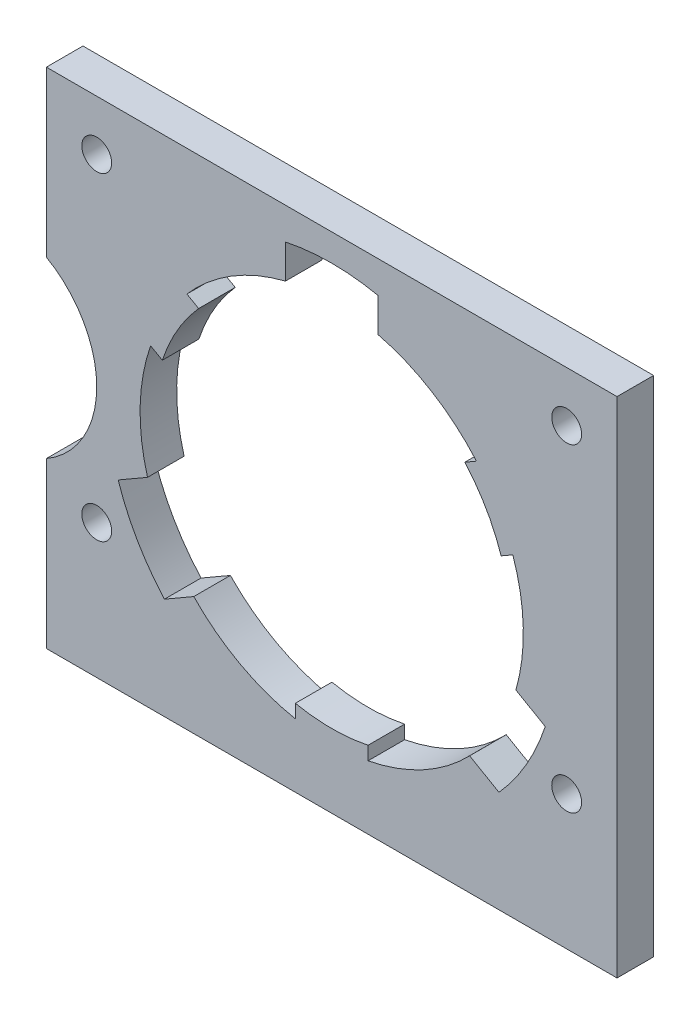
ISO-10303-21;
HEADER;
FILE_DESCRIPTION(('STEP AP214'),'2;1');
FILE_NAME('part.step','',(''),(''),'','','');
FILE_SCHEMA(('AUTOMOTIVE_DESIGN { 1 0 10303 214 1 1 1 1 }'));
ENDSEC;
DATA;
#1=APPLICATION_CONTEXT('core data for automotive mechanical design processes');
#2=APPLICATION_PROTOCOL_DEFINITION('international standard','automotive_design',2000,#1);
#3=PRODUCT_CONTEXT('',#1,'mechanical');
#4=PRODUCT('Part','Part','',(#3));
#5=PRODUCT_RELATED_PRODUCT_CATEGORY('part','',(#4));
#6=PRODUCT_DEFINITION_FORMATION('','',#4);
#7=PRODUCT_DEFINITION_CONTEXT('part definition',#1,'design');
#8=PRODUCT_DEFINITION('design','',#6,#7);
#9=PRODUCT_DEFINITION_SHAPE('','',#8);
#10=(LENGTH_UNIT() NAMED_UNIT(*) SI_UNIT(.MILLI.,.METRE.));
#11=(NAMED_UNIT(*) PLANE_ANGLE_UNIT() SI_UNIT($,.RADIAN.));
#12=(NAMED_UNIT(*) SI_UNIT($,.STERADIAN.) SOLID_ANGLE_UNIT());
#13=UNCERTAINTY_MEASURE_WITH_UNIT(LENGTH_MEASURE(1.E-05),#10,'distance_accuracy_value','');
#14=(GEOMETRIC_REPRESENTATION_CONTEXT(3) GLOBAL_UNCERTAINTY_ASSIGNED_CONTEXT((#13)) GLOBAL_UNIT_ASSIGNED_CONTEXT((#10,
#11,#12)) REPRESENTATION_CONTEXT('',''));
#15=CARTESIAN_POINT('',(0.,0.,0.));
#16=DIRECTION('',(0.,0.,1.));
#17=DIRECTION('',(1.,0.,0.));
#18=AXIS2_PLACEMENT_3D('',#15,#16,#17);
#19=CARTESIAN_POINT('',(-21.59,19.05,2.76860000000001));
#20=DIRECTION('',(1.,0.,0.));
#21=DIRECTION('',(0.,1.,0.));
#22=AXIS2_PLACEMENT_3D('',#19,#20,#21);
#23=PLANE('',#22);
#24=DIRECTION('',(0.,-1.,0.));
#25=VECTOR('',#24,1.);
#26=CARTESIAN_POINT('',(-21.59,19.05,0.));
#27=LINE('',#26,#25);
#28=CARTESIAN_POINT('',(-21.59,19.05,0.));
#29=VERTEX_POINT('',#28);
#30=CARTESIAN_POINT('',(-21.59,6.59911357683742,0.));
#31=VERTEX_POINT('',#30);
#32=EDGE_CURVE('E256',#29,#31,#27,.T.);
#33=ORIENTED_EDGE('',*,*,#32,.T.);
#34=DIRECTION('',(0.,0.,1.));
#35=VECTOR('',#34,1.);
#36=CARTESIAN_POINT('',(-21.59,6.59911357683742,0.));
#37=LINE('',#36,#35);
#38=CARTESIAN_POINT('',(-21.59,6.59911357683742,2.76860000000001));
#39=VERTEX_POINT('',#38);
#40=EDGE_CURVE('E56',#31,#39,#37,.T.);
#41=ORIENTED_EDGE('',*,*,#40,.T.);
#42=DIRECTION('',(0.,-1.,0.));
#43=VECTOR('',#42,1.);
#44=CARTESIAN_POINT('',(-21.59,19.05,2.76860000000001));
#45=LINE('',#44,#43);
#46=CARTESIAN_POINT('',(-21.59,19.05,2.76860000000001));
#47=VERTEX_POINT('',#46);
#48=EDGE_CURVE('E291',#47,#39,#45,.T.);
#49=ORIENTED_EDGE('',*,*,#48,.F.);
#50=DIRECTION('',(0.,0.,-1.));
#51=VECTOR('',#50,1.);
#52=CARTESIAN_POINT('',(-21.59,19.05,2.76860000000001));
#53=LINE('',#52,#51);
#54=EDGE_CURVE('E271',#47,#29,#53,.T.);
#55=ORIENTED_EDGE('',*,*,#54,.T.);
#56=EDGE_LOOP('',(#33,#41,#49,#55));
#57=FACE_BOUND('',#56,.T.);
#58=ADVANCED_FACE('F41',(#57),#23,.F.);
#59=CARTESIAN_POINT('',(0.,0.,0.));
#60=DIRECTION('',(0.,0.,1.));
#61=DIRECTION('',(1.,0.,0.));
#62=AXIS2_PLACEMENT_3D('',#59,#60,#61);
#63=CYLINDRICAL_SURFACE('',#62,14.5);
#64=CARTESIAN_POINT('',(0.,0.,0.));
#65=DIRECTION('',(0.,0.,1.));
#66=DIRECTION('',(1.,0.,0.));
#67=AXIS2_PLACEMENT_3D('',#64,#65,#66);
#68=CIRCLE('',#67,14.5);
#69=CARTESIAN_POINT('',(-13.7044616670802,4.73684815204473,0.));
#70=VERTEX_POINT('',#69);
#71=CARTESIAN_POINT('',(-13.9360576069539,-4.00453472648968,0.));
#72=VERTEX_POINT('',#71);
#73=EDGE_CURVE('E286',#70,#72,#68,.T.);
#74=ORIENTED_EDGE('',*,*,#73,.F.);
#75=DIRECTION('',(0.,0.,1.));
#76=VECTOR('',#75,1.);
#77=CARTESIAN_POINT('',(-13.7044616670802,4.73684815204473,-6.40359303305341));
#78=LINE('',#77,#76);
#79=CARTESIAN_POINT('',(-13.7044616670802,4.73684815204473,2.76860000000001));
#80=VERTEX_POINT('',#79);
#81=EDGE_CURVE('E63',#70,#80,#78,.T.);
#82=ORIENTED_EDGE('',*,*,#81,.T.);
#83=CARTESIAN_POINT('',(0.,0.,2.76860000000001));
#84=DIRECTION('',(0.,0.,1.));
#85=DIRECTION('',(1.,0.,0.));
#86=AXIS2_PLACEMENT_3D('',#83,#84,#85);
#87=CIRCLE('',#86,14.5);
#88=CARTESIAN_POINT('',(-13.9360576069539,-4.00453472648968,2.76860000000001));
#89=VERTEX_POINT('',#88);
#90=EDGE_CURVE('E299',#80,#89,#87,.T.);
#91=ORIENTED_EDGE('',*,*,#90,.T.);
#92=DIRECTION('',(0.,0.,1.));
#93=VECTOR('',#92,1.);
#94=CARTESIAN_POINT('',(-13.9360576069539,-4.00453472648968,0.));
#95=LINE('',#94,#93);
#96=EDGE_CURVE('E337',#72,#89,#95,.T.);
#97=ORIENTED_EDGE('',*,*,#96,.F.);
#98=EDGE_LOOP('',(#74,#82,#91,#97));
#99=FACE_BOUND('',#98,.T.);
#100=ADVANCED_FACE('F582',(#99),#63,.F.);
#101=CARTESIAN_POINT('',(10.9544616670802,9.49998787285908,0.));
#102=VERTEX_POINT('',#101);
#103=CARTESIAN_POINT('',(3.5,14.0712472794703,0.));
#104=VERTEX_POINT('',#103);
#105=EDGE_CURVE('E298',#102,#104,#68,.T.);
#106=ORIENTED_EDGE('',*,*,#105,.F.);
#107=DIRECTION('',(0.,0.,1.));
#108=VECTOR('',#107,1.);
#109=CARTESIAN_POINT('',(10.9544616670802,9.49998787285908,-6.40359303305341));
#110=LINE('',#109,#108);
#111=CARTESIAN_POINT('',(10.9544616670802,9.49998787285908,2.76860000000001));
#112=VERTEX_POINT('',#111);
#113=EDGE_CURVE('E417',#102,#112,#110,.T.);
#114=ORIENTED_EDGE('',*,*,#113,.T.);
#115=CARTESIAN_POINT('',(3.5,14.0712472794703,2.76860000000001));
#116=VERTEX_POINT('',#115);
#117=EDGE_CURVE('E313',#112,#116,#87,.T.);
#118=ORIENTED_EDGE('',*,*,#117,.T.);
#119=DIRECTION('',(0.,0.,1.));
#120=VECTOR('',#119,1.);
#121=CARTESIAN_POINT('',(3.5,14.0712472794703,0.));
#122=LINE('',#121,#120);
#123=EDGE_CURVE('E308',#104,#116,#122,.T.);
#124=ORIENTED_EDGE('',*,*,#123,.F.);
#125=EDGE_LOOP('',(#106,#114,#118,#124));
#126=FACE_BOUND('',#125,.T.);
#127=ADVANCED_FACE('F515',(#126),#63,.F.);
#128=CARTESIAN_POINT('',(2.74999999999986,-14.2368360249039,0.));
#129=VERTEX_POINT('',#128);
#130=CARTESIAN_POINT('',(10.436057606954,-10.0667125529806,0.));
#131=VERTEX_POINT('',#130);
#132=EDGE_CURVE('E502',#129,#131,#68,.T.);
#133=ORIENTED_EDGE('',*,*,#132,.F.);
#134=DIRECTION('',(0.,0.,1.));
#135=VECTOR('',#134,1.);
#136=CARTESIAN_POINT('',(2.74999999999986,-14.2368360249039,-5.64767591592305));
#137=LINE('',#136,#135);
#138=CARTESIAN_POINT('',(2.74999999999986,-14.2368360249039,2.76860000000001));
#139=VERTEX_POINT('',#138);
#140=EDGE_CURVE('E392',#129,#139,#137,.T.);
#141=ORIENTED_EDGE('',*,*,#140,.T.);
#142=CARTESIAN_POINT('',(10.436057606954,-10.0667125529806,2.76860000000001));
#143=VERTEX_POINT('',#142);
#144=EDGE_CURVE('E519',#139,#143,#87,.T.);
#145=ORIENTED_EDGE('',*,*,#144,.T.);
#146=DIRECTION('',(0.,0.,1.));
#147=VECTOR('',#146,1.);
#148=CARTESIAN_POINT('',(10.436057606954,-10.0667125529806,0.));
#149=LINE('',#148,#147);
#150=EDGE_CURVE('E364',#131,#143,#149,.T.);
#151=ORIENTED_EDGE('',*,*,#150,.F.);
#152=EDGE_LOOP('',(#133,#141,#145,#151));
#153=FACE_BOUND('',#152,.T.);
#154=ADVANCED_FACE('F544',(#153),#63,.F.);
#155=CARTESIAN_POINT('',(-10.4360576069539,-10.0667125529807,2.76860000000001));
#156=VERTEX_POINT('',#155);
#157=CARTESIAN_POINT('',(-2.75000000000013,-14.2368360249038,2.76860000000001));
#158=VERTEX_POINT('',#157);
#159=EDGE_CURVE('E300',#156,#158,#87,.T.);
#160=ORIENTED_EDGE('',*,*,#159,.T.);
#161=DIRECTION('',(0.,0.,1.));
#162=VECTOR('',#161,1.);
#163=CARTESIAN_POINT('',(-2.75000000000013,-14.2368360249038,-5.64767591592305));
#164=LINE('',#163,#162);
#165=CARTESIAN_POINT('',(-2.75000000000013,-14.2368360249038,0.));
#166=VERTEX_POINT('',#165);
#167=EDGE_CURVE('E389',#166,#158,#164,.T.);
#168=ORIENTED_EDGE('',*,*,#167,.F.);
#169=CARTESIAN_POINT('',(-10.4360576069539,-10.0667125529807,0.));
#170=VERTEX_POINT('',#169);
#171=EDGE_CURVE('E288',#170,#166,#68,.T.);
#172=ORIENTED_EDGE('',*,*,#171,.F.);
#173=DIRECTION('',(0.,0.,1.));
#174=VECTOR('',#173,1.);
#175=CARTESIAN_POINT('',(-10.4360576069539,-10.0667125529807,0.));
#176=LINE('',#175,#174);
#177=EDGE_CURVE('E333',#170,#156,#176,.T.);
#178=ORIENTED_EDGE('',*,*,#177,.T.);
#179=EDGE_LOOP('',(#160,#168,#172,#178));
#180=FACE_BOUND('',#179,.T.);
#181=ADVANCED_FACE('F526',(#180),#63,.F.);
#182=CARTESIAN_POINT('',(-3.49999999999999,14.0712472794703,2.76860000000001));
#183=VERTEX_POINT('',#182);
#184=CARTESIAN_POINT('',(-10.9544616670802,9.49998787285913,2.76860000000001));
#185=VERTEX_POINT('',#184);
#186=EDGE_CURVE('E296',#183,#185,#87,.T.);
#187=ORIENTED_EDGE('',*,*,#186,.T.);
#188=DIRECTION('',(0.,0.,1.));
#189=VECTOR('',#188,1.);
#190=CARTESIAN_POINT('',(-10.9544616670802,9.49998787285913,-6.40359303305341));
#191=LINE('',#190,#189);
#192=CARTESIAN_POINT('',(-10.9544616670802,9.49998787285913,0.));
#193=VERTEX_POINT('',#192);
#194=EDGE_CURVE('E439',#193,#185,#191,.T.);
#195=ORIENTED_EDGE('',*,*,#194,.F.);
#196=CARTESIAN_POINT('',(-3.5,14.0712472794703,0.));
#197=VERTEX_POINT('',#196);
#198=EDGE_CURVE('E284',#197,#193,#68,.T.);
#199=ORIENTED_EDGE('',*,*,#198,.F.);
#200=DIRECTION('',(0.,0.,1.));
#201=VECTOR('',#200,1.);
#202=CARTESIAN_POINT('',(-3.5,14.0712472794703,0.));
#203=LINE('',#202,#201);
#204=EDGE_CURVE('E304',#197,#183,#203,.T.);
#205=ORIENTED_EDGE('',*,*,#204,.T.);
#206=EDGE_LOOP('',(#187,#195,#199,#205));
#207=FACE_BOUND('',#206,.T.);
#208=ADVANCED_FACE('F600',(#207),#63,.F.);
#209=CARTESIAN_POINT('',(21.59,19.05,2.76860000000001));
#210=DIRECTION('',(-1.,0.,0.));
#211=DIRECTION('',(0.,0.,1.));
#212=AXIS2_PLACEMENT_3D('',#209,#210,#211);
#213=PLANE('',#212);
#214=DIRECTION('',(0.,1.,0.));
#215=VECTOR('',#214,1.);
#216=CARTESIAN_POINT('',(21.59,19.05,0.));
#217=LINE('',#216,#215);
#218=CARTESIAN_POINT('',(21.59,-19.05,0.));
#219=VERTEX_POINT('',#218);
#220=CARTESIAN_POINT('',(21.59,19.05,0.));
#221=VERTEX_POINT('',#220);
#222=EDGE_CURVE('E259',#219,#221,#217,.T.);
#223=ORIENTED_EDGE('',*,*,#222,.T.);
#224=DIRECTION('',(0.,0.,-1.));
#225=VECTOR('',#224,1.);
#226=CARTESIAN_POINT('',(21.59,19.05,2.76860000000001));
#227=LINE('',#226,#225);
#228=CARTESIAN_POINT('',(21.59,19.05,2.76860000000001));
#229=VERTEX_POINT('',#228);
#230=EDGE_CURVE('E49',#229,#221,#227,.T.);
#231=ORIENTED_EDGE('',*,*,#230,.F.);
#232=DIRECTION('',(0.,1.,0.));
#233=VECTOR('',#232,1.);
#234=CARTESIAN_POINT('',(21.59,19.05,2.76860000000001));
#235=LINE('',#234,#233);
#236=CARTESIAN_POINT('',(21.59,-19.05,2.76860000000001));
#237=VERTEX_POINT('',#236);
#238=EDGE_CURVE('E264',#237,#229,#235,.T.);
#239=ORIENTED_EDGE('',*,*,#238,.F.);
#240=DIRECTION('',(0.,0.,-1.));
#241=VECTOR('',#240,1.);
#242=CARTESIAN_POINT('',(21.59,-19.05,2.76860000000001));
#243=LINE('',#242,#241);
#244=EDGE_CURVE('E265',#237,#219,#243,.T.);
#245=ORIENTED_EDGE('',*,*,#244,.T.);
#246=EDGE_LOOP('',(#223,#231,#239,#245));
#247=FACE_BOUND('',#246,.T.);
#248=ADVANCED_FACE('F43',(#247),#213,.F.);
#249=CARTESIAN_POINT('',(-21.59,19.05,2.76860000000001));
#250=DIRECTION('',(0.,-1.,0.));
#251=DIRECTION('',(0.,0.,-1.));
#252=AXIS2_PLACEMENT_3D('',#249,#250,#251);
#253=PLANE('',#252);
#254=DIRECTION('',(-1.,0.,0.));
#255=VECTOR('',#254,1.);
#256=CARTESIAN_POINT('',(-21.59,19.05,0.));
#257=LINE('',#256,#255);
#258=EDGE_CURVE('E257',#221,#29,#257,.T.);
#259=ORIENTED_EDGE('',*,*,#258,.T.);
#260=ORIENTED_EDGE('',*,*,#54,.F.);
#261=DIRECTION('',(-1.,0.,0.));
#262=VECTOR('',#261,1.);
#263=CARTESIAN_POINT('',(-21.59,19.05,2.76860000000001));
#264=LINE('',#263,#262);
#265=EDGE_CURVE('E279',#229,#47,#264,.T.);
#266=ORIENTED_EDGE('',*,*,#265,.F.);
#267=ORIENTED_EDGE('',*,*,#230,.T.);
#268=EDGE_LOOP('',(#259,#260,#266,#267));
#269=FACE_BOUND('',#268,.T.);
#270=ADVANCED_FACE('F277',(#269),#253,.F.);
#271=CARTESIAN_POINT('',(-21.59,-6.59911357683742,2.76860000000001));
#272=VERTEX_POINT('',#271);
#273=CARTESIAN_POINT('',(-21.59,-19.05,2.76860000000001));
#274=VERTEX_POINT('',#273);
#275=EDGE_CURVE('E249',#272,#274,#45,.T.);
#276=ORIENTED_EDGE('',*,*,#275,.F.);
#277=DIRECTION('',(0.,0.,1.));
#278=VECTOR('',#277,1.);
#279=CARTESIAN_POINT('',(-21.59,-6.59911357683742,0.));
#280=LINE('',#279,#278);
#281=CARTESIAN_POINT('',(-21.59,-6.59911357683742,0.));
#282=VERTEX_POINT('',#281);
#283=EDGE_CURVE('E237',#272,#282,#280,.F.);
#284=ORIENTED_EDGE('',*,*,#283,.T.);
#285=CARTESIAN_POINT('',(-21.59,-19.05,0.));
#286=VERTEX_POINT('',#285);
#287=EDGE_CURVE('E247',#282,#286,#27,.T.);
#288=ORIENTED_EDGE('',*,*,#287,.T.);
#289=DIRECTION('',(0.,0.,-1.));
#290=VECTOR('',#289,1.);
#291=CARTESIAN_POINT('',(-21.59,-19.05,2.76860000000001));
#292=LINE('',#291,#290);
#293=EDGE_CURVE('E268',#274,#286,#292,.T.);
#294=ORIENTED_EDGE('',*,*,#293,.F.);
#295=EDGE_LOOP('',(#276,#284,#288,#294));
#296=FACE_BOUND('',#295,.T.);
#297=ADVANCED_FACE('F245',(#296),#23,.F.);
#298=CARTESIAN_POINT('',(-21.59,-19.05,2.76860000000001));
#299=DIRECTION('',(0.,1.,0.));
#300=DIRECTION('',(0.,0.,1.));
#301=AXIS2_PLACEMENT_3D('',#298,#299,#300);
#302=PLANE('',#301);
#303=DIRECTION('',(1.,0.,0.));
#304=VECTOR('',#303,1.);
#305=CARTESIAN_POINT('',(-21.59,-19.05,0.));
#306=LINE('',#305,#304);
#307=EDGE_CURVE('E255',#286,#219,#306,.T.);
#308=ORIENTED_EDGE('',*,*,#307,.T.);
#309=ORIENTED_EDGE('',*,*,#244,.F.);
#310=DIRECTION('',(1.,0.,0.));
#311=VECTOR('',#310,1.);
#312=CARTESIAN_POINT('',(-21.59,-19.05,2.76860000000001));
#313=LINE('',#312,#311);
#314=EDGE_CURVE('E269',#274,#237,#313,.T.);
#315=ORIENTED_EDGE('',*,*,#314,.F.);
#316=ORIENTED_EDGE('',*,*,#293,.T.);
#317=EDGE_LOOP('',(#308,#309,#315,#316));
#318=FACE_BOUND('',#317,.T.);
#319=ADVANCED_FACE('F591',(#318),#302,.F.);
#320=CARTESIAN_POINT('',(0.,0.,2.76860000000001));
#321=DIRECTION('',(0.,0.,1.));
#322=DIRECTION('',(1.,0.,0.));
#323=AXIS2_PLACEMENT_3D('',#320,#321,#322);
#324=PLANE('',#323);
#325=CARTESIAN_POINT('',(17.78,15.24,2.76860000000001));
#326=DIRECTION('',(0.,0.,-1.));
#327=DIRECTION('',(-1.,0.,0.));
#328=AXIS2_PLACEMENT_3D('',#325,#326,#327);
#329=CIRCLE('',#328,1.1303);
#330=CARTESIAN_POINT('',(16.6497,15.24,2.76860000000001));
#331=VERTEX_POINT('',#330);
#332=EDGE_CURVE('E476',#331,#331,#329,.T.);
#333=ORIENTED_EDGE('',*,*,#332,.T.);
#334=EDGE_LOOP('',(#333));
#335=FACE_BOUND('',#334,.T.);
#336=CARTESIAN_POINT('',(17.78,-8.89,2.76860000000001));
#337=DIRECTION('',(0.,0.,-1.));
#338=DIRECTION('',(-1.,0.,0.));
#339=AXIS2_PLACEMENT_3D('',#336,#337,#338);
#340=CIRCLE('',#339,1.1303);
#341=CARTESIAN_POINT('',(16.6497,-8.89,2.76860000000001));
#342=VERTEX_POINT('',#341);
#343=EDGE_CURVE('E470',#342,#342,#340,.T.);
#344=ORIENTED_EDGE('',*,*,#343,.T.);
#345=EDGE_LOOP('',(#344));
#346=FACE_BOUND('',#345,.T.);
#347=CARTESIAN_POINT('',(-17.78,-8.89,2.76860000000001));
#348=DIRECTION('',(0.,0.,-1.));
#349=DIRECTION('',(-1.,0.,0.));
#350=AXIS2_PLACEMENT_3D('',#347,#348,#349);
#351=CIRCLE('',#350,1.1303);
#352=CARTESIAN_POINT('',(-18.9103,-8.89,2.76860000000001));
#353=VERTEX_POINT('',#352);
#354=EDGE_CURVE('E464',#353,#353,#351,.T.);
#355=ORIENTED_EDGE('',*,*,#354,.T.);
#356=EDGE_LOOP('',(#355));
#357=FACE_BOUND('',#356,.T.);
#358=CARTESIAN_POINT('',(-17.78,15.24,2.76860000000001));
#359=DIRECTION('',(0.,0.,-1.));
#360=DIRECTION('',(-1.,0.,0.));
#361=AXIS2_PLACEMENT_3D('',#358,#359,#360);
#362=CIRCLE('',#361,1.1303);
#363=CARTESIAN_POINT('',(-18.9103,15.24,2.76860000000001));
#364=VERTEX_POINT('',#363);
#365=EDGE_CURVE('E458',#364,#364,#362,.T.);
#366=ORIENTED_EDGE('',*,*,#365,.T.);
#367=EDGE_LOOP('',(#366));
#368=FACE_BOUND('',#367,.T.);
#369=CARTESIAN_POINT('',(-25.4,0.,2.76860000000001));
#370=DIRECTION('',(0.,0.,1.));
#371=DIRECTION('',(1.,0.,0.));
#372=AXIS2_PLACEMENT_3D('',#369,#370,#371);
#373=CIRCLE('',#372,7.62);
#374=EDGE_CURVE('E250',#272,#39,#373,.T.);
#375=ORIENTED_EDGE('',*,*,#374,.F.);
#376=ORIENTED_EDGE('',*,*,#275,.T.);
#377=ORIENTED_EDGE('',*,*,#314,.T.);
#378=ORIENTED_EDGE('',*,*,#238,.T.);
#379=ORIENTED_EDGE('',*,*,#265,.T.);
#380=ORIENTED_EDGE('',*,*,#48,.T.);
#381=EDGE_LOOP('',(#375,#376,#377,#378,#379,#380));
#382=FACE_BOUND('',#381,.T.);
#383=DIRECTION('',(0.866025403784443,-0.499999999999992,0.));
#384=VECTOR('',#383,1.);
#385=CARTESIAN_POINT('',(12.657029534224,-11.3489912930525,2.76860000000001));
#386=LINE('',#385,#384);
#387=CARTESIAN_POINT('',(12.657029534224,-11.3489912930525,2.76860000000001));
#388=VERTEX_POINT('',#387);
#389=EDGE_CURVE('E368',#143,#388,#386,.T.);
#390=ORIENTED_EDGE('',*,*,#389,.F.);
#391=ORIENTED_EDGE('',*,*,#144,.F.);
#392=DIRECTION('',(0.,1.,0.));
#393=VECTOR('',#392,1.);
#394=CARTESIAN_POINT('',(2.74999999999987,-13.2169398878863,2.76860000000001));
#395=LINE('',#394,#393);
#396=CARTESIAN_POINT('',(2.74999999999987,-13.2169398878863,2.76860000000001));
#397=VERTEX_POINT('',#396);
#398=EDGE_CURVE('E390',#139,#397,#395,.T.);
#399=ORIENTED_EDGE('',*,*,#398,.T.);
#400=CARTESIAN_POINT('',(0.,0.,2.76860000000001));
#401=DIRECTION('',(0.,0.,-1.));
#402=DIRECTION('',(1.,0.,0.));
#403=AXIS2_PLACEMENT_3D('',#400,#401,#402);
#404=CIRCLE('',#403,13.5);
#405=CARTESIAN_POINT('',(-2.75000000000013,-13.2169398878863,2.76860000000001));
#406=VERTEX_POINT('',#405);
#407=EDGE_CURVE('E403',#397,#406,#404,.T.);
#408=ORIENTED_EDGE('',*,*,#407,.T.);
#409=DIRECTION('',(0.,-1.,0.));
#410=VECTOR('',#409,1.);
#411=CARTESIAN_POINT('',(-2.75000000000013,-13.2169398878863,2.76860000000001));
#412=LINE('',#411,#410);
#413=EDGE_CURVE('E400',#406,#158,#412,.T.);
#414=ORIENTED_EDGE('',*,*,#413,.T.);
#415=ORIENTED_EDGE('',*,*,#159,.F.);
#416=DIRECTION('',(0.866025403784436,0.500000000000004,0.));
#417=VECTOR('',#416,1.);
#418=CARTESIAN_POINT('',(-12.6570295342239,-11.3489912930527,2.76860000000001));
#419=LINE('',#418,#417);
#420=CARTESIAN_POINT('',(-12.6570295342239,-11.3489912930527,2.76860000000001));
#421=VERTEX_POINT('',#420);
#422=EDGE_CURVE('E345',#421,#156,#419,.T.);
#423=ORIENTED_EDGE('',*,*,#422,.F.);
#424=CARTESIAN_POINT('',(0.,0.,2.76860000000001));
#425=DIRECTION('',(0.,0.,1.));
#426=DIRECTION('',(-0.500000000000004,0.866025403784436,0.));
#427=AXIS2_PLACEMENT_3D('',#424,#425,#426);
#428=CIRCLE('',#427,17.);
#429=CARTESIAN_POINT('',(-16.1570295342239,-5.2868134665616,2.76860000000001));
#430=VERTEX_POINT('',#429);
#431=EDGE_CURVE('E347',#430,#421,#428,.T.);
#432=ORIENTED_EDGE('',*,*,#431,.F.);
#433=DIRECTION('',(-0.866025403784436,-0.500000000000004,0.));
#434=VECTOR('',#433,1.);
#435=CARTESIAN_POINT('',(-16.1570295342239,-5.2868134665616,2.76860000000001));
#436=LINE('',#435,#434);
#437=EDGE_CURVE('E341',#89,#430,#436,.T.);
#438=ORIENTED_EDGE('',*,*,#437,.F.);
#439=ORIENTED_EDGE('',*,*,#90,.F.);
#440=DIRECTION('',(0.866025403784443,-0.499999999999992,0.));
#441=VECTOR('',#440,1.);
#442=CARTESIAN_POINT('',(-12.8212057032014,4.22690008353595,2.76860000000001));
#443=LINE('',#442,#441);
#444=CARTESIAN_POINT('',(-12.8212057032014,4.22690008353595,2.76860000000001));
#445=VERTEX_POINT('',#444);
#446=EDGE_CURVE('E440',#80,#445,#443,.T.);
#447=ORIENTED_EDGE('',*,*,#446,.T.);
#448=CARTESIAN_POINT('',(0.,0.,2.76860000000001));
#449=DIRECTION('',(0.,0.,-1.));
#450=DIRECTION('',(-0.499999999999992,-0.866025403784443,0.));
#451=AXIS2_PLACEMENT_3D('',#448,#449,#450);
#452=CIRCLE('',#451,13.5);
#453=CARTESIAN_POINT('',(-10.0712057032014,8.99003980435037,2.76860000000001));
#454=VERTEX_POINT('',#453);
#455=EDGE_CURVE('E451',#445,#454,#452,.T.);
#456=ORIENTED_EDGE('',*,*,#455,.T.);
#457=DIRECTION('',(-0.866025403784443,0.499999999999992,0.));
#458=VECTOR('',#457,1.);
#459=CARTESIAN_POINT('',(-10.0712057032014,8.99003980435037,2.76860000000001));
#460=LINE('',#459,#458);
#461=EDGE_CURVE('E448',#454,#185,#460,.T.);
#462=ORIENTED_EDGE('',*,*,#461,.T.);
#463=ORIENTED_EDGE('',*,*,#186,.F.);
#464=DIRECTION('',(0.,-1.,0.));
#465=VECTOR('',#464,1.);
#466=CARTESIAN_POINT('',(-3.5,16.6358047596141,2.76860000000001));
#467=LINE('',#466,#465);
#468=CARTESIAN_POINT('',(-3.5,16.6358047596141,2.76860000000001));
#469=VERTEX_POINT('',#468);
#470=EDGE_CURVE('E318',#469,#183,#467,.T.);
#471=ORIENTED_EDGE('',*,*,#470,.F.);
#472=CARTESIAN_POINT('',(0.,0.,2.76860000000001));
#473=DIRECTION('',(0.,0.,1.));
#474=DIRECTION('',(1.,0.,0.));
#475=AXIS2_PLACEMENT_3D('',#472,#473,#474);
#476=CIRCLE('',#475,17.);
#477=CARTESIAN_POINT('',(3.5,16.6358047596141,2.76860000000001));
#478=VERTEX_POINT('',#477);
#479=EDGE_CURVE('E320',#478,#469,#476,.T.);
#480=ORIENTED_EDGE('',*,*,#479,.F.);
#481=DIRECTION('',(0.,1.,0.));
#482=VECTOR('',#481,1.);
#483=CARTESIAN_POINT('',(3.5,16.6358047596141,2.76860000000001));
#484=LINE('',#483,#482);
#485=EDGE_CURVE('E314',#116,#478,#484,.T.);
#486=ORIENTED_EDGE('',*,*,#485,.F.);
#487=ORIENTED_EDGE('',*,*,#117,.F.);
#488=DIRECTION('',(-0.866025403784436,-0.500000000000004,0.));
#489=VECTOR('',#488,1.);
#490=CARTESIAN_POINT('',(10.0712057032014,8.99003980435031,2.76860000000001));
#491=LINE('',#490,#489);
#492=CARTESIAN_POINT('',(10.0712057032014,8.99003980435031,2.76860000000001));
#493=VERTEX_POINT('',#492);
#494=EDGE_CURVE('E415',#112,#493,#491,.T.);
#495=ORIENTED_EDGE('',*,*,#494,.T.);
#496=CARTESIAN_POINT('',(0.,0.,2.76860000000001));
#497=DIRECTION('',(0.,0.,-1.));
#498=DIRECTION('',(-0.500000000000004,0.866025403784436,0.));
#499=AXIS2_PLACEMENT_3D('',#496,#497,#498);
#500=CIRCLE('',#499,13.5);
#501=CARTESIAN_POINT('',(12.8212057032014,4.22690008353588,2.76860000000001));
#502=VERTEX_POINT('',#501);
#503=EDGE_CURVE('E428',#493,#502,#500,.T.);
#504=ORIENTED_EDGE('',*,*,#503,.T.);
#505=DIRECTION('',(0.866025403784436,0.500000000000004,0.));
#506=VECTOR('',#505,1.);
#507=CARTESIAN_POINT('',(12.8212057032014,4.22690008353588,2.76860000000001));
#508=LINE('',#507,#506);
#509=CARTESIAN_POINT('',(13.7044616670802,4.73684815204466,2.76860000000001));
#510=VERTEX_POINT('',#509);
#511=EDGE_CURVE('E425',#502,#510,#508,.T.);
#512=ORIENTED_EDGE('',*,*,#511,.T.);
#513=CARTESIAN_POINT('',(13.936057606954,-4.00453472648948,2.76860000000001));
#514=VERTEX_POINT('',#513);
#515=EDGE_CURVE('E518',#514,#510,#87,.T.);
#516=ORIENTED_EDGE('',*,*,#515,.F.);
#517=DIRECTION('',(-0.866025403784443,0.499999999999992,0.));
#518=VECTOR('',#517,1.);
#519=CARTESIAN_POINT('',(16.157029534224,-5.28681346656139,2.76860000000001));
#520=LINE('',#519,#518);
#521=CARTESIAN_POINT('',(16.157029534224,-5.28681346656139,2.76860000000001));
#522=VERTEX_POINT('',#521);
#523=EDGE_CURVE('E372',#522,#514,#520,.T.);
#524=ORIENTED_EDGE('',*,*,#523,.F.);
#525=CARTESIAN_POINT('',(0.,0.,2.76860000000001));
#526=DIRECTION('',(0.,0.,1.));
#527=DIRECTION('',(-0.499999999999992,-0.866025403784443,0.));
#528=AXIS2_PLACEMENT_3D('',#525,#526,#527);
#529=CIRCLE('',#528,17.);
#530=EDGE_CURVE('E374',#388,#522,#529,.T.);
#531=ORIENTED_EDGE('',*,*,#530,.F.);
#532=EDGE_LOOP('',(#390,#391,#399,#408,#414,#415,#423,#432,#438,#439,#447,#456,#462,#463,#471,
#480,#486,#487,#495,#504,#512,#516,#524,#531));
#533=FACE_BOUND('',#532,.T.);
#534=ADVANCED_FACE('F488',(#335,#346,#357,#368,#382,#533),#324,.T.);
#535=CARTESIAN_POINT('',(0.,0.,0.));
#536=DIRECTION('',(0.,0.,1.));
#537=DIRECTION('',(1.,0.,0.));
#538=AXIS2_PLACEMENT_3D('',#535,#536,#537);
#539=PLANE('',#538);
#540=CARTESIAN_POINT('',(17.78,15.24,0.));
#541=DIRECTION('',(0.,0.,-1.));
#542=DIRECTION('',(-1.,0.,0.));
#543=AXIS2_PLACEMENT_3D('',#540,#541,#542);
#544=CIRCLE('',#543,1.1303);
#545=CARTESIAN_POINT('',(16.6497,15.24,0.));
#546=VERTEX_POINT('',#545);
#547=EDGE_CURVE('E479',#546,#546,#544,.T.);
#548=ORIENTED_EDGE('',*,*,#547,.F.);
#549=EDGE_LOOP('',(#548));
#550=FACE_BOUND('',#549,.T.);
#551=CARTESIAN_POINT('',(17.78,-8.89,0.));
#552=DIRECTION('',(0.,0.,-1.));
#553=DIRECTION('',(-1.,0.,0.));
#554=AXIS2_PLACEMENT_3D('',#551,#552,#553);
#555=CIRCLE('',#554,1.1303);
#556=CARTESIAN_POINT('',(16.6497,-8.89,0.));
#557=VERTEX_POINT('',#556);
#558=EDGE_CURVE('E473',#557,#557,#555,.T.);
#559=ORIENTED_EDGE('',*,*,#558,.F.);
#560=EDGE_LOOP('',(#559));
#561=FACE_BOUND('',#560,.T.);
#562=CARTESIAN_POINT('',(-17.78,-8.89,0.));
#563=DIRECTION('',(0.,0.,-1.));
#564=DIRECTION('',(-1.,0.,0.));
#565=AXIS2_PLACEMENT_3D('',#562,#563,#564);
#566=CIRCLE('',#565,1.1303);
#567=CARTESIAN_POINT('',(-18.9103,-8.89,0.));
#568=VERTEX_POINT('',#567);
#569=EDGE_CURVE('E467',#568,#568,#566,.T.);
#570=ORIENTED_EDGE('',*,*,#569,.F.);
#571=EDGE_LOOP('',(#570));
#572=FACE_BOUND('',#571,.T.);
#573=CARTESIAN_POINT('',(-17.78,15.24,0.));
#574=DIRECTION('',(0.,0.,-1.));
#575=DIRECTION('',(-1.,0.,0.));
#576=AXIS2_PLACEMENT_3D('',#573,#574,#575);
#577=CIRCLE('',#576,1.1303);
#578=CARTESIAN_POINT('',(-18.9103,15.24,0.));
#579=VERTEX_POINT('',#578);
#580=EDGE_CURVE('E461',#579,#579,#577,.T.);
#581=ORIENTED_EDGE('',*,*,#580,.F.);
#582=EDGE_LOOP('',(#581));
#583=FACE_BOUND('',#582,.T.);
#584=ORIENTED_EDGE('',*,*,#171,.T.);
#585=DIRECTION('',(0.,1.,0.));
#586=VECTOR('',#585,1.);
#587=CARTESIAN_POINT('',(-2.75000000000013,-13.2169398878863,0.));
#588=LINE('',#587,#586);
#589=CARTESIAN_POINT('',(-2.75000000000013,-13.2169398878863,0.));
#590=VERTEX_POINT('',#589);
#591=EDGE_CURVE('E377',#166,#590,#588,.T.);
#592=ORIENTED_EDGE('',*,*,#591,.T.);
#593=CARTESIAN_POINT('',(0.,0.,0.));
#594=DIRECTION('',(0.,0.,1.));
#595=DIRECTION('',(1.,0.,0.));
#596=AXIS2_PLACEMENT_3D('',#593,#594,#595);
#597=CIRCLE('',#596,13.5);
#598=CARTESIAN_POINT('',(2.74999999999987,-13.2169398878863,0.));
#599=VERTEX_POINT('',#598);
#600=EDGE_CURVE('E386',#590,#599,#597,.T.);
#601=ORIENTED_EDGE('',*,*,#600,.T.);
#602=DIRECTION('',(0.,-1.,0.));
#603=VECTOR('',#602,1.);
#604=CARTESIAN_POINT('',(2.74999999999987,-13.2169398878863,0.));
#605=LINE('',#604,#603);
#606=EDGE_CURVE('E397',#599,#129,#605,.T.);
#607=ORIENTED_EDGE('',*,*,#606,.T.);
#608=ORIENTED_EDGE('',*,*,#132,.T.);
#609=DIRECTION('',(0.866025403784443,-0.499999999999992,0.));
#610=VECTOR('',#609,1.);
#611=CARTESIAN_POINT('',(12.657029534224,-11.3489912930525,0.));
#612=LINE('',#611,#610);
#613=CARTESIAN_POINT('',(12.657029534224,-11.3489912930525,0.));
#614=VERTEX_POINT('',#613);
#615=EDGE_CURVE('E361',#131,#614,#612,.T.);
#616=ORIENTED_EDGE('',*,*,#615,.T.);
#617=CARTESIAN_POINT('',(0.,0.,0.));
#618=DIRECTION('',(0.,0.,1.));
#619=DIRECTION('',(-0.499999999999992,-0.866025403784443,0.));
#620=AXIS2_PLACEMENT_3D('',#617,#618,#619);
#621=CIRCLE('',#620,17.);
#622=CARTESIAN_POINT('',(16.157029534224,-5.28681346656139,0.));
#623=VERTEX_POINT('',#622);
#624=EDGE_CURVE('E371',#614,#623,#621,.T.);
#625=ORIENTED_EDGE('',*,*,#624,.T.);
#626=DIRECTION('',(-0.866025403784443,0.499999999999992,0.));
#627=VECTOR('',#626,1.);
#628=CARTESIAN_POINT('',(16.157029534224,-5.28681346656139,0.));
#629=LINE('',#628,#627);
#630=CARTESIAN_POINT('',(13.936057606954,-4.00453472648948,0.));
#631=VERTEX_POINT('',#630);
#632=EDGE_CURVE('E380',#623,#631,#629,.T.);
#633=ORIENTED_EDGE('',*,*,#632,.T.);
#634=CARTESIAN_POINT('',(13.7044616670802,4.73684815204466,0.));
#635=VERTEX_POINT('',#634);
#636=EDGE_CURVE('E503',#631,#635,#68,.T.);
#637=ORIENTED_EDGE('',*,*,#636,.T.);
#638=DIRECTION('',(-0.866025403784436,-0.500000000000004,0.));
#639=VECTOR('',#638,1.);
#640=CARTESIAN_POINT('',(12.8212057032014,4.22690008353588,0.));
#641=LINE('',#640,#639);
#642=CARTESIAN_POINT('',(12.8212057032014,4.22690008353588,0.));
#643=VERTEX_POINT('',#642);
#644=EDGE_CURVE('E406',#635,#643,#641,.T.);
#645=ORIENTED_EDGE('',*,*,#644,.T.);
#646=CARTESIAN_POINT('',(0.,0.,0.));
#647=DIRECTION('',(0.,0.,1.));
#648=DIRECTION('',(1.,0.,0.));
#649=AXIS2_PLACEMENT_3D('',#646,#647,#648);
#650=CIRCLE('',#649,13.5);
#651=CARTESIAN_POINT('',(10.0712057032014,8.99003980435031,0.));
#652=VERTEX_POINT('',#651);
#653=EDGE_CURVE('E411',#643,#652,#650,.T.);
#654=ORIENTED_EDGE('',*,*,#653,.T.);
#655=DIRECTION('',(0.866025403784436,0.500000000000004,0.));
#656=VECTOR('',#655,1.);
#657=CARTESIAN_POINT('',(10.0712057032014,8.99003980435031,0.));
#658=LINE('',#657,#656);
#659=EDGE_CURVE('E422',#652,#102,#658,.T.);
#660=ORIENTED_EDGE('',*,*,#659,.T.);
#661=ORIENTED_EDGE('',*,*,#105,.T.);
#662=DIRECTION('',(0.,1.,0.));
#663=VECTOR('',#662,1.);
#664=CARTESIAN_POINT('',(3.5,16.6358047596141,0.));
#665=LINE('',#664,#663);
#666=CARTESIAN_POINT('',(3.5,16.6358047596141,0.));
#667=VERTEX_POINT('',#666);
#668=EDGE_CURVE('E305',#104,#667,#665,.T.);
#669=ORIENTED_EDGE('',*,*,#668,.T.);
#670=CARTESIAN_POINT('',(0.,0.,0.));
#671=DIRECTION('',(0.,0.,1.));
#672=DIRECTION('',(1.,0.,0.));
#673=AXIS2_PLACEMENT_3D('',#670,#671,#672);
#674=CIRCLE('',#673,17.);
#675=CARTESIAN_POINT('',(-3.5,16.6358047596141,0.));
#676=VERTEX_POINT('',#675);
#677=EDGE_CURVE('E317',#667,#676,#674,.T.);
#678=ORIENTED_EDGE('',*,*,#677,.T.);
#679=DIRECTION('',(0.,-1.,0.));
#680=VECTOR('',#679,1.);
#681=CARTESIAN_POINT('',(-3.5,16.6358047596141,0.));
#682=LINE('',#681,#680);
#683=EDGE_CURVE('E326',#676,#197,#682,.T.);
#684=ORIENTED_EDGE('',*,*,#683,.T.);
#685=ORIENTED_EDGE('',*,*,#198,.T.);
#686=DIRECTION('',(0.866025403784443,-0.499999999999992,0.));
#687=VECTOR('',#686,1.);
#688=CARTESIAN_POINT('',(-10.0712057032014,8.99003980435037,0.));
#689=LINE('',#688,#687);
#690=CARTESIAN_POINT('',(-10.0712057032014,8.99003980435037,0.));
#691=VERTEX_POINT('',#690);
#692=EDGE_CURVE('E431',#193,#691,#689,.T.);
#693=ORIENTED_EDGE('',*,*,#692,.T.);
#694=CARTESIAN_POINT('',(0.,0.,0.));
#695=DIRECTION('',(0.,0.,1.));
#696=DIRECTION('',(1.,0.,0.));
#697=AXIS2_PLACEMENT_3D('',#694,#695,#696);
#698=CIRCLE('',#697,13.5);
#699=CARTESIAN_POINT('',(-12.8212057032014,4.22690008353595,0.));
#700=VERTEX_POINT('',#699);
#701=EDGE_CURVE('E436',#691,#700,#698,.T.);
#702=ORIENTED_EDGE('',*,*,#701,.T.);
#703=DIRECTION('',(-0.866025403784443,0.499999999999992,0.));
#704=VECTOR('',#703,1.);
#705=CARTESIAN_POINT('',(-12.8212057032014,4.22690008353595,0.));
#706=LINE('',#705,#704);
#707=EDGE_CURVE('E445',#700,#70,#706,.T.);
#708=ORIENTED_EDGE('',*,*,#707,.T.);
#709=ORIENTED_EDGE('',*,*,#73,.T.);
#710=DIRECTION('',(-0.866025403784436,-0.500000000000004,0.));
#711=VECTOR('',#710,1.);
#712=CARTESIAN_POINT('',(-16.1570295342239,-5.2868134665616,0.));
#713=LINE('',#712,#711);
#714=CARTESIAN_POINT('',(-16.1570295342239,-5.2868134665616,0.));
#715=VERTEX_POINT('',#714);
#716=EDGE_CURVE('E334',#72,#715,#713,.T.);
#717=ORIENTED_EDGE('',*,*,#716,.T.);
#718=CARTESIAN_POINT('',(0.,0.,0.));
#719=DIRECTION('',(0.,0.,1.));
#720=DIRECTION('',(-0.500000000000004,0.866025403784436,0.));
#721=AXIS2_PLACEMENT_3D('',#718,#719,#720);
#722=CIRCLE('',#721,17.);
#723=CARTESIAN_POINT('',(-12.6570295342239,-11.3489912930527,0.));
#724=VERTEX_POINT('',#723);
#725=EDGE_CURVE('E344',#715,#724,#722,.T.);
#726=ORIENTED_EDGE('',*,*,#725,.T.);
#727=DIRECTION('',(0.866025403784436,0.500000000000004,0.));
#728=VECTOR('',#727,1.);
#729=CARTESIAN_POINT('',(-12.6570295342239,-11.3489912930527,0.));
#730=LINE('',#729,#728);
#731=EDGE_CURVE('E353',#724,#170,#730,.T.);
#732=ORIENTED_EDGE('',*,*,#731,.T.);
#733=EDGE_LOOP('',(#584,#592,#601,#607,#608,#616,#625,#633,#637,#645,#654,#660,#661,#669,#678,
#684,#685,#693,#702,#708,#709,#717,#726,#732));
#734=FACE_BOUND('',#733,.T.);
#735=ORIENTED_EDGE('',*,*,#287,.F.);
#736=CARTESIAN_POINT('',(-25.4,0.,0.));
#737=DIRECTION('',(0.,0.,1.));
#738=DIRECTION('',(1.,0.,0.));
#739=AXIS2_PLACEMENT_3D('',#736,#737,#738);
#740=CIRCLE('',#739,7.62);
#741=EDGE_CURVE('E11',#282,#31,#740,.T.);
#742=ORIENTED_EDGE('',*,*,#741,.T.);
#743=ORIENTED_EDGE('',*,*,#32,.F.);
#744=ORIENTED_EDGE('',*,*,#258,.F.);
#745=ORIENTED_EDGE('',*,*,#222,.F.);
#746=ORIENTED_EDGE('',*,*,#307,.F.);
#747=EDGE_LOOP('',(#735,#742,#743,#744,#745,#746));
#748=FACE_BOUND('',#747,.T.);
#749=ADVANCED_FACE('F253',(#550,#561,#572,#583,#734,#748),#539,.F.);
#750=ORIENTED_EDGE('',*,*,#515,.T.);
#751=DIRECTION('',(0.,0.,1.));
#752=VECTOR('',#751,1.);
#753=CARTESIAN_POINT('',(13.7044616670802,4.73684815204466,-6.40359303305341));
#754=LINE('',#753,#752);
#755=EDGE_CURVE('E414',#635,#510,#754,.T.);
#756=ORIENTED_EDGE('',*,*,#755,.F.);
#757=ORIENTED_EDGE('',*,*,#636,.F.);
#758=DIRECTION('',(0.,0.,1.));
#759=VECTOR('',#758,1.);
#760=CARTESIAN_POINT('',(13.936057606954,-4.00453472648948,0.));
#761=LINE('',#760,#759);
#762=EDGE_CURVE('E360',#631,#514,#761,.T.);
#763=ORIENTED_EDGE('',*,*,#762,.T.);
#764=EDGE_LOOP('',(#750,#756,#757,#763));
#765=FACE_BOUND('',#764,.T.);
#766=ADVANCED_FACE('F487',(#765),#63,.F.);
#767=CARTESIAN_POINT('',(0.,0.,0.));
#768=DIRECTION('',(0.,0.,1.));
#769=DIRECTION('',(1.,0.,0.));
#770=AXIS2_PLACEMENT_3D('',#767,#768,#769);
#771=CYLINDRICAL_SURFACE('',#770,17.);
#772=ORIENTED_EDGE('',*,*,#479,.T.);
#773=DIRECTION('',(0.,0.,1.));
#774=VECTOR('',#773,1.);
#775=CARTESIAN_POINT('',(-3.5,16.6358047596141,0.));
#776=LINE('',#775,#774);
#777=EDGE_CURVE('E302',#676,#469,#776,.T.);
#778=ORIENTED_EDGE('',*,*,#777,.F.);
#779=ORIENTED_EDGE('',*,*,#677,.F.);
#780=DIRECTION('',(0.,0.,1.));
#781=VECTOR('',#780,1.);
#782=CARTESIAN_POINT('',(3.5,16.6358047596141,0.));
#783=LINE('',#782,#781);
#784=EDGE_CURVE('E311',#667,#478,#783,.T.);
#785=ORIENTED_EDGE('',*,*,#784,.T.);
#786=EDGE_LOOP('',(#772,#778,#779,#785));
#787=FACE_BOUND('',#786,.T.);
#788=ADVANCED_FACE('F611',(#787),#771,.F.);
#789=CARTESIAN_POINT('',(3.5,16.6358047596141,0.));
#790=DIRECTION('',(1.,0.,0.));
#791=DIRECTION('',(0.,0.,-1.));
#792=AXIS2_PLACEMENT_3D('',#789,#790,#791);
#793=PLANE('',#792);
#794=ORIENTED_EDGE('',*,*,#485,.T.);
#795=ORIENTED_EDGE('',*,*,#784,.F.);
#796=ORIENTED_EDGE('',*,*,#668,.F.);
#797=ORIENTED_EDGE('',*,*,#123,.T.);
#798=EDGE_LOOP('',(#794,#795,#796,#797));
#799=FACE_BOUND('',#798,.T.);
#800=ADVANCED_FACE('F512',(#799),#793,.F.);
#801=CARTESIAN_POINT('',(-3.5,16.6358047596141,0.));
#802=DIRECTION('',(-1.,0.,0.));
#803=DIRECTION('',(0.,0.,1.));
#804=AXIS2_PLACEMENT_3D('',#801,#802,#803);
#805=PLANE('',#804);
#806=ORIENTED_EDGE('',*,*,#470,.T.);
#807=ORIENTED_EDGE('',*,*,#204,.F.);
#808=ORIENTED_EDGE('',*,*,#683,.F.);
#809=ORIENTED_EDGE('',*,*,#777,.T.);
#810=EDGE_LOOP('',(#806,#807,#808,#809));
#811=FACE_BOUND('',#810,.T.);
#812=ADVANCED_FACE('F619',(#811),#805,.F.);
#813=CARTESIAN_POINT('',(0.,0.,0.));
#814=DIRECTION('',(0.,0.,1.));
#815=DIRECTION('',(1.,0.,0.));
#816=AXIS2_PLACEMENT_3D('',#813,#814,#815);
#817=CYLINDRICAL_SURFACE('',#816,17.);
#818=ORIENTED_EDGE('',*,*,#431,.T.);
#819=DIRECTION('',(0.,0.,1.));
#820=VECTOR('',#819,1.);
#821=CARTESIAN_POINT('',(-12.6570295342239,-11.3489912930527,0.));
#822=LINE('',#821,#820);
#823=EDGE_CURVE('E331',#724,#421,#822,.T.);
#824=ORIENTED_EDGE('',*,*,#823,.F.);
#825=ORIENTED_EDGE('',*,*,#725,.F.);
#826=DIRECTION('',(0.,0.,1.));
#827=VECTOR('',#826,1.);
#828=CARTESIAN_POINT('',(-16.1570295342239,-5.2868134665616,0.));
#829=LINE('',#828,#827);
#830=EDGE_CURVE('E323',#715,#430,#829,.T.);
#831=ORIENTED_EDGE('',*,*,#830,.T.);
#832=EDGE_LOOP('',(#818,#824,#825,#831));
#833=FACE_BOUND('',#832,.T.);
#834=ADVANCED_FACE('F623',(#833),#817,.F.);
#835=CARTESIAN_POINT('',(-16.1570295342239,-5.2868134665616,0.));
#836=DIRECTION('',(-0.500000000000004,0.866025403784436,0.));
#837=DIRECTION('',(-0.866025403784436,-0.500000000000004,0.));
#838=AXIS2_PLACEMENT_3D('',#835,#836,#837);
#839=PLANE('',#838);
#840=ORIENTED_EDGE('',*,*,#437,.T.);
#841=ORIENTED_EDGE('',*,*,#830,.F.);
#842=ORIENTED_EDGE('',*,*,#716,.F.);
#843=ORIENTED_EDGE('',*,*,#96,.T.);
#844=EDGE_LOOP('',(#840,#841,#842,#843));
#845=FACE_BOUND('',#844,.T.);
#846=ADVANCED_FACE('F628',(#845),#839,.F.);
#847=CARTESIAN_POINT('',(-12.6570295342239,-11.3489912930527,0.));
#848=DIRECTION('',(0.500000000000004,-0.866025403784436,0.));
#849=DIRECTION('',(0.866025403784436,0.500000000000004,0.));
#850=AXIS2_PLACEMENT_3D('',#847,#848,#849);
#851=PLANE('',#850);
#852=ORIENTED_EDGE('',*,*,#422,.T.);
#853=ORIENTED_EDGE('',*,*,#177,.F.);
#854=ORIENTED_EDGE('',*,*,#731,.F.);
#855=ORIENTED_EDGE('',*,*,#823,.T.);
#856=EDGE_LOOP('',(#852,#853,#854,#855));
#857=FACE_BOUND('',#856,.T.);
#858=ADVANCED_FACE('F630',(#857),#851,.F.);
#859=CARTESIAN_POINT('',(0.,0.,0.));
#860=DIRECTION('',(0.,0.,1.));
#861=DIRECTION('',(1.,0.,0.));
#862=AXIS2_PLACEMENT_3D('',#859,#860,#861);
#863=CYLINDRICAL_SURFACE('',#862,17.);
#864=ORIENTED_EDGE('',*,*,#530,.T.);
#865=DIRECTION('',(0.,0.,1.));
#866=VECTOR('',#865,1.);
#867=CARTESIAN_POINT('',(16.157029534224,-5.28681346656139,0.));
#868=LINE('',#867,#866);
#869=EDGE_CURVE('E358',#623,#522,#868,.T.);
#870=ORIENTED_EDGE('',*,*,#869,.F.);
#871=ORIENTED_EDGE('',*,*,#624,.F.);
#872=DIRECTION('',(0.,0.,1.));
#873=VECTOR('',#872,1.);
#874=CARTESIAN_POINT('',(12.657029534224,-11.3489912930525,0.));
#875=LINE('',#874,#873);
#876=EDGE_CURVE('E350',#614,#388,#875,.T.);
#877=ORIENTED_EDGE('',*,*,#876,.T.);
#878=EDGE_LOOP('',(#864,#870,#871,#877));
#879=FACE_BOUND('',#878,.T.);
#880=ADVANCED_FACE('F554',(#879),#863,.F.);
#881=CARTESIAN_POINT('',(12.657029534224,-11.3489912930525,0.));
#882=DIRECTION('',(-0.499999999999992,-0.866025403784443,0.));
#883=DIRECTION('',(0.866025403784443,-0.499999999999992,0.));
#884=AXIS2_PLACEMENT_3D('',#881,#882,#883);
#885=PLANE('',#884);
#886=ORIENTED_EDGE('',*,*,#389,.T.);
#887=ORIENTED_EDGE('',*,*,#876,.F.);
#888=ORIENTED_EDGE('',*,*,#615,.F.);
#889=ORIENTED_EDGE('',*,*,#150,.T.);
#890=EDGE_LOOP('',(#886,#887,#888,#889));
#891=FACE_BOUND('',#890,.T.);
#892=ADVANCED_FACE('F549',(#891),#885,.F.);
#893=CARTESIAN_POINT('',(16.157029534224,-5.28681346656139,0.));
#894=DIRECTION('',(0.499999999999992,0.866025403784443,0.));
#895=DIRECTION('',(-0.866025403784443,0.499999999999992,0.));
#896=AXIS2_PLACEMENT_3D('',#893,#894,#895);
#897=PLANE('',#896);
#898=ORIENTED_EDGE('',*,*,#523,.T.);
#899=ORIENTED_EDGE('',*,*,#762,.F.);
#900=ORIENTED_EDGE('',*,*,#632,.F.);
#901=ORIENTED_EDGE('',*,*,#869,.T.);
#902=EDGE_LOOP('',(#898,#899,#900,#901));
#903=FACE_BOUND('',#902,.T.);
#904=ADVANCED_FACE('F556',(#903),#897,.F.);
#905=CARTESIAN_POINT('',(0.,0.,-5.64767591592305));
#906=DIRECTION('',(0.,0.,1.));
#907=DIRECTION('',(1.,0.,0.));
#908=AXIS2_PLACEMENT_3D('',#905,#906,#907);
#909=CYLINDRICAL_SURFACE('',#908,13.5);
#910=ORIENTED_EDGE('',*,*,#600,.F.);
#911=DIRECTION('',(0.,0.,1.));
#912=VECTOR('',#911,1.);
#913=CARTESIAN_POINT('',(-2.75000000000013,-13.2169398878863,-5.64767591592305));
#914=LINE('',#913,#912);
#915=EDGE_CURVE('E387',#590,#406,#914,.T.);
#916=ORIENTED_EDGE('',*,*,#915,.T.);
#917=ORIENTED_EDGE('',*,*,#407,.F.);
#918=DIRECTION('',(0.,0.,1.));
#919=VECTOR('',#918,1.);
#920=CARTESIAN_POINT('',(2.74999999999987,-13.2169398878863,-5.64767591592305));
#921=LINE('',#920,#919);
#922=EDGE_CURVE('E395',#599,#397,#921,.T.);
#923=ORIENTED_EDGE('',*,*,#922,.F.);
#924=EDGE_LOOP('',(#910,#916,#917,#923));
#925=FACE_BOUND('',#924,.T.);
#926=ADVANCED_FACE('F536',(#925),#909,.F.);
#927=CARTESIAN_POINT('',(2.74999999999987,-13.2169398878863,-5.64767591592305));
#928=DIRECTION('',(1.,0.,0.));
#929=DIRECTION('',(0.,0.,-1.));
#930=AXIS2_PLACEMENT_3D('',#927,#928,#929);
#931=PLANE('',#930);
#932=ORIENTED_EDGE('',*,*,#606,.F.);
#933=ORIENTED_EDGE('',*,*,#922,.T.);
#934=ORIENTED_EDGE('',*,*,#398,.F.);
#935=ORIENTED_EDGE('',*,*,#140,.F.);
#936=EDGE_LOOP('',(#932,#933,#934,#935));
#937=FACE_BOUND('',#936,.T.);
#938=ADVANCED_FACE('F541',(#937),#931,.T.);
#939=CARTESIAN_POINT('',(-2.75000000000013,-13.2169398878863,-5.64767591592305));
#940=DIRECTION('',(-1.,0.,0.));
#941=DIRECTION('',(0.,0.,1.));
#942=AXIS2_PLACEMENT_3D('',#939,#940,#941);
#943=PLANE('',#942);
#944=ORIENTED_EDGE('',*,*,#591,.F.);
#945=ORIENTED_EDGE('',*,*,#167,.T.);
#946=ORIENTED_EDGE('',*,*,#413,.F.);
#947=ORIENTED_EDGE('',*,*,#915,.F.);
#948=EDGE_LOOP('',(#944,#945,#946,#947));
#949=FACE_BOUND('',#948,.T.);
#950=ADVANCED_FACE('F534',(#949),#943,.T.);
#951=CARTESIAN_POINT('',(0.,0.,-6.40359303305341));
#952=DIRECTION('',(0.,0.,1.));
#953=DIRECTION('',(1.,0.,0.));
#954=AXIS2_PLACEMENT_3D('',#951,#952,#953);
#955=CYLINDRICAL_SURFACE('',#954,13.5);
#956=ORIENTED_EDGE('',*,*,#653,.F.);
#957=DIRECTION('',(0.,0.,1.));
#958=VECTOR('',#957,1.);
#959=CARTESIAN_POINT('',(12.8212057032014,4.22690008353588,-6.40359303305341));
#960=LINE('',#959,#958);
#961=EDGE_CURVE('E412',#643,#502,#960,.T.);
#962=ORIENTED_EDGE('',*,*,#961,.T.);
#963=ORIENTED_EDGE('',*,*,#503,.F.);
#964=DIRECTION('',(0.,0.,1.));
#965=VECTOR('',#964,1.);
#966=CARTESIAN_POINT('',(10.0712057032014,8.99003980435031,-6.40359303305341));
#967=LINE('',#966,#965);
#968=EDGE_CURVE('E420',#652,#493,#967,.T.);
#969=ORIENTED_EDGE('',*,*,#968,.F.);
#970=EDGE_LOOP('',(#956,#962,#963,#969));
#971=FACE_BOUND('',#970,.T.);
#972=ADVANCED_FACE('F568',(#971),#955,.F.);
#973=CARTESIAN_POINT('',(10.0712057032014,8.99003980435031,-6.40359303305341));
#974=DIRECTION('',(-0.500000000000004,0.866025403784436,0.));
#975=DIRECTION('',(-0.866025403784436,-0.500000000000004,0.));
#976=AXIS2_PLACEMENT_3D('',#973,#974,#975);
#977=PLANE('',#976);
#978=ORIENTED_EDGE('',*,*,#659,.F.);
#979=ORIENTED_EDGE('',*,*,#968,.T.);
#980=ORIENTED_EDGE('',*,*,#494,.F.);
#981=ORIENTED_EDGE('',*,*,#113,.F.);
#982=EDGE_LOOP('',(#978,#979,#980,#981));
#983=FACE_BOUND('',#982,.T.);
#984=ADVANCED_FACE('F570',(#983),#977,.T.);
#985=CARTESIAN_POINT('',(12.8212057032014,4.22690008353588,-6.40359303305341));
#986=DIRECTION('',(0.500000000000004,-0.866025403784436,0.));
#987=DIRECTION('',(0.866025403784436,0.500000000000004,0.));
#988=AXIS2_PLACEMENT_3D('',#985,#986,#987);
#989=PLANE('',#988);
#990=ORIENTED_EDGE('',*,*,#644,.F.);
#991=ORIENTED_EDGE('',*,*,#755,.T.);
#992=ORIENTED_EDGE('',*,*,#511,.F.);
#993=ORIENTED_EDGE('',*,*,#961,.F.);
#994=EDGE_LOOP('',(#990,#991,#992,#993));
#995=FACE_BOUND('',#994,.T.);
#996=ADVANCED_FACE('F564',(#995),#989,.T.);
#997=CARTESIAN_POINT('',(0.,0.,-6.40359303305341));
#998=DIRECTION('',(0.,0.,1.));
#999=DIRECTION('',(1.,0.,0.));
#1000=AXIS2_PLACEMENT_3D('',#997,#998,#999);
#1001=CYLINDRICAL_SURFACE('',#1000,13.5);
#1002=ORIENTED_EDGE('',*,*,#701,.F.);
#1003=DIRECTION('',(0.,0.,1.));
#1004=VECTOR('',#1003,1.);
#1005=CARTESIAN_POINT('',(-10.0712057032014,8.99003980435037,-6.40359303305341));
#1006=LINE('',#1005,#1004);
#1007=EDGE_CURVE('E437',#691,#454,#1006,.T.);
#1008=ORIENTED_EDGE('',*,*,#1007,.T.);
#1009=ORIENTED_EDGE('',*,*,#455,.F.);
#1010=DIRECTION('',(0.,0.,1.));
#1011=VECTOR('',#1010,1.);
#1012=CARTESIAN_POINT('',(-12.8212057032014,4.22690008353595,-6.40359303305341));
#1013=LINE('',#1012,#1011);
#1014=EDGE_CURVE('E443',#700,#445,#1013,.T.);
#1015=ORIENTED_EDGE('',*,*,#1014,.F.);
#1016=EDGE_LOOP('',(#1002,#1008,#1009,#1015));
#1017=FACE_BOUND('',#1016,.T.);
#1018=ADVANCED_FACE('F577',(#1017),#1001,.F.);
#1019=CARTESIAN_POINT('',(-12.8212057032014,4.22690008353595,-6.40359303305341));
#1020=DIRECTION('',(-0.499999999999992,-0.866025403784443,0.));
#1021=DIRECTION('',(0.866025403784443,-0.499999999999992,0.));
#1022=AXIS2_PLACEMENT_3D('',#1019,#1020,#1021);
#1023=PLANE('',#1022);
#1024=ORIENTED_EDGE('',*,*,#707,.F.);
#1025=ORIENTED_EDGE('',*,*,#1014,.T.);
#1026=ORIENTED_EDGE('',*,*,#446,.F.);
#1027=ORIENTED_EDGE('',*,*,#81,.F.);
#1028=EDGE_LOOP('',(#1024,#1025,#1026,#1027));
#1029=FACE_BOUND('',#1028,.T.);
#1030=ADVANCED_FACE('F679',(#1029),#1023,.T.);
#1031=CARTESIAN_POINT('',(-10.0712057032014,8.99003980435037,-6.40359303305341));
#1032=DIRECTION('',(0.499999999999992,0.866025403784443,0.));
#1033=DIRECTION('',(-0.866025403784443,0.499999999999992,0.));
#1034=AXIS2_PLACEMENT_3D('',#1031,#1032,#1033);
#1035=PLANE('',#1034);
#1036=ORIENTED_EDGE('',*,*,#692,.F.);
#1037=ORIENTED_EDGE('',*,*,#194,.T.);
#1038=ORIENTED_EDGE('',*,*,#461,.F.);
#1039=ORIENTED_EDGE('',*,*,#1007,.F.);
#1040=EDGE_LOOP('',(#1036,#1037,#1038,#1039));
#1041=FACE_BOUND('',#1040,.T.);
#1042=ADVANCED_FACE('F686',(#1041),#1035,.T.);
#1043=CARTESIAN_POINT('',(-25.4,0.,0.));
#1044=DIRECTION('',(0.,0.,1.));
#1045=DIRECTION('',(1.,0.,0.));
#1046=AXIS2_PLACEMENT_3D('',#1043,#1044,#1045);
#1047=CYLINDRICAL_SURFACE('',#1046,7.62);
#1048=ORIENTED_EDGE('',*,*,#741,.F.);
#1049=ORIENTED_EDGE('',*,*,#283,.F.);
#1050=ORIENTED_EDGE('',*,*,#374,.T.);
#1051=ORIENTED_EDGE('',*,*,#40,.F.);
#1052=EDGE_LOOP('',(#1048,#1049,#1050,#1051));
#1053=FACE_BOUND('',#1052,.T.);
#1054=ADVANCED_FACE('F236',(#1053),#1047,.F.);
#1055=CARTESIAN_POINT('',(-17.78,15.24,0.));
#1056=DIRECTION('',(0.,0.,-1.));
#1057=DIRECTION('',(-1.,0.,0.));
#1058=AXIS2_PLACEMENT_3D('',#1055,#1056,#1057);
#1059=CYLINDRICAL_SURFACE('',#1058,1.1303);
#1060=ORIENTED_EDGE('',*,*,#365,.F.);
#1061=EDGE_LOOP('',(#1060));
#1062=FACE_BOUND('',#1061,.T.);
#1063=ORIENTED_EDGE('',*,*,#580,.T.);
#1064=EDGE_LOOP('',(#1063));
#1065=FACE_BOUND('',#1064,.T.);
#1066=ADVANCED_FACE('F702',(#1062,#1065),#1059,.F.);
#1067=CARTESIAN_POINT('',(-17.78,-8.89,0.));
#1068=DIRECTION('',(0.,0.,-1.));
#1069=DIRECTION('',(-1.,0.,0.));
#1070=AXIS2_PLACEMENT_3D('',#1067,#1068,#1069);
#1071=CYLINDRICAL_SURFACE('',#1070,1.1303);
#1072=ORIENTED_EDGE('',*,*,#354,.F.);
#1073=EDGE_LOOP('',(#1072));
#1074=FACE_BOUND('',#1073,.T.);
#1075=ORIENTED_EDGE('',*,*,#569,.T.);
#1076=EDGE_LOOP('',(#1075));
#1077=FACE_BOUND('',#1076,.T.);
#1078=ADVANCED_FACE('F709',(#1074,#1077),#1071,.F.);
#1079=CARTESIAN_POINT('',(17.78,-8.89,0.));
#1080=DIRECTION('',(0.,0.,-1.));
#1081=DIRECTION('',(-1.,0.,0.));
#1082=AXIS2_PLACEMENT_3D('',#1079,#1080,#1081);
#1083=CYLINDRICAL_SURFACE('',#1082,1.1303);
#1084=ORIENTED_EDGE('',*,*,#343,.F.);
#1085=EDGE_LOOP('',(#1084));
#1086=FACE_BOUND('',#1085,.T.);
#1087=ORIENTED_EDGE('',*,*,#558,.T.);
#1088=EDGE_LOOP('',(#1087));
#1089=FACE_BOUND('',#1088,.T.);
#1090=ADVANCED_FACE('F717',(#1086,#1089),#1083,.F.);
#1091=CARTESIAN_POINT('',(17.78,15.24,0.));
#1092=DIRECTION('',(0.,0.,-1.));
#1093=DIRECTION('',(-1.,0.,0.));
#1094=AXIS2_PLACEMENT_3D('',#1091,#1092,#1093);
#1095=CYLINDRICAL_SURFACE('',#1094,1.1303);
#1096=ORIENTED_EDGE('',*,*,#332,.F.);
#1097=EDGE_LOOP('',(#1096));
#1098=FACE_BOUND('',#1097,.T.);
#1099=ORIENTED_EDGE('',*,*,#547,.T.);
#1100=EDGE_LOOP('',(#1099));
#1101=FACE_BOUND('',#1100,.T.);
#1102=ADVANCED_FACE('F483',(#1098,#1101),#1095,.F.);
#1103=CLOSED_SHELL('',(#58,#100,#127,#154,#181,#208,#248,#270,#297,#319,#534,#749,#766,#788,
#800,#812,#834,#846,#858,#880,#892,#904,#926,#938,#950,#972,#984,#996,#1018,#1030,#1042,#1054,
#1066,#1078,#1090,#1102));
#1104=MANIFOLD_SOLID_BREP('B2',#1103);
#1105=ADVANCED_BREP_SHAPE_REPRESENTATION('',(#18,#1104),#14);
#1106=SHAPE_DEFINITION_REPRESENTATION(#9,#1105);
ENDSEC;
END-ISO-10303-21;
